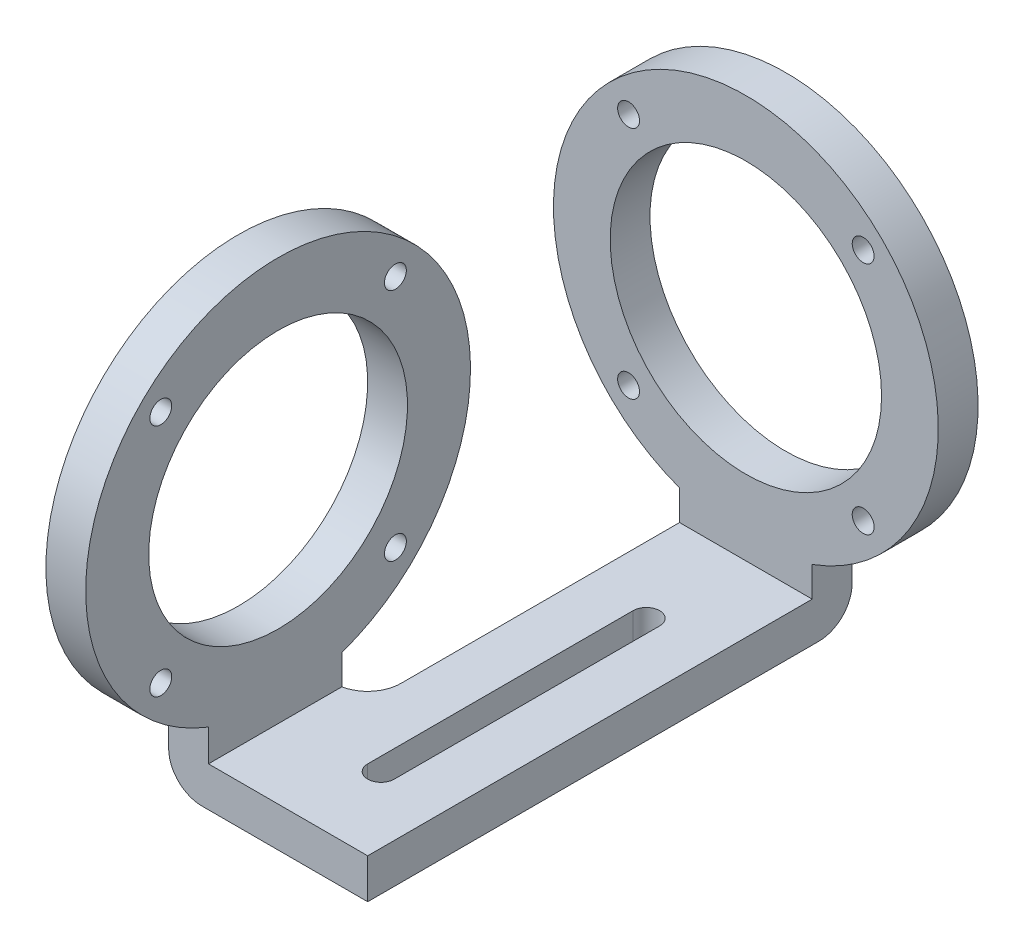
ISO-10303-21;
HEADER;
FILE_DESCRIPTION(('STEP AP214'),'2;1');
FILE_NAME('part.step','',(''),(''),'','','');
FILE_SCHEMA(('AUTOMOTIVE_DESIGN { 1 0 10303 214 1 1 1 1 }'));
ENDSEC;
DATA;
#1=APPLICATION_CONTEXT('core data for automotive mechanical design processes');
#2=APPLICATION_PROTOCOL_DEFINITION('international standard','automotive_design',2000,#1);
#3=PRODUCT_CONTEXT('',#1,'mechanical');
#4=PRODUCT('Part','Part','',(#3));
#5=PRODUCT_RELATED_PRODUCT_CATEGORY('part','',(#4));
#6=PRODUCT_DEFINITION_FORMATION('','',#4);
#7=PRODUCT_DEFINITION_CONTEXT('part definition',#1,'design');
#8=PRODUCT_DEFINITION('design','',#6,#7);
#9=PRODUCT_DEFINITION_SHAPE('','',#8);
#10=(LENGTH_UNIT() NAMED_UNIT(*) SI_UNIT(.MILLI.,.METRE.));
#11=(NAMED_UNIT(*) PLANE_ANGLE_UNIT() SI_UNIT($,.RADIAN.));
#12=(NAMED_UNIT(*) SI_UNIT($,.STERADIAN.) SOLID_ANGLE_UNIT());
#13=UNCERTAINTY_MEASURE_WITH_UNIT(LENGTH_MEASURE(1.E-05),#10,'distance_accuracy_value','');
#14=(GEOMETRIC_REPRESENTATION_CONTEXT(3) GLOBAL_UNCERTAINTY_ASSIGNED_CONTEXT((#13)) GLOBAL_UNIT_ASSIGNED_CONTEXT((#10,
#11,#12)) REPRESENTATION_CONTEXT('',''));
#15=CARTESIAN_POINT('',(0.,0.,0.));
#16=DIRECTION('',(0.,0.,1.));
#17=DIRECTION('',(1.,0.,0.));
#18=AXIS2_PLACEMENT_3D('',#15,#16,#17);
#19=CARTESIAN_POINT('',(-9.99999999999999,-31.748471388918,73.));
#20=DIRECTION('',(0.,-1.,0.));
#21=DIRECTION('',(0.,0.,-1.));
#22=AXIS2_PLACEMENT_3D('',#19,#20,#21);
#23=PLANE('',#22);
#24=DIRECTION('',(0.,0.,1.));
#25=VECTOR('',#24,1.);
#26=CARTESIAN_POINT('',(2.00000000000001,-31.748471388918,61.));
#27=LINE('',#26,#25);
#28=CARTESIAN_POINT('',(2.,-31.748471388918,21.));
#29=VERTEX_POINT('',#28);
#30=CARTESIAN_POINT('',(2.00000000000001,-31.748471388918,61.));
#31=VERTEX_POINT('',#30);
#32=EDGE_CURVE('E174',#29,#31,#27,.T.);
#33=ORIENTED_EDGE('',*,*,#32,.T.);
#34=CARTESIAN_POINT('',(0.,-31.748471388918,61.));
#35=DIRECTION('',(0.,-1.,0.));
#36=DIRECTION('',(0.,0.,-1.));
#37=AXIS2_PLACEMENT_3D('',#34,#35,#36);
#38=CIRCLE('',#37,2.00000000000001);
#39=CARTESIAN_POINT('',(-2.00000000000001,-31.748471388918,61.));
#40=VERTEX_POINT('',#39);
#41=EDGE_CURVE('E165',#31,#40,#38,.T.);
#42=ORIENTED_EDGE('',*,*,#41,.T.);
#43=DIRECTION('',(0.,0.,-1.));
#44=VECTOR('',#43,1.);
#45=CARTESIAN_POINT('',(-2.00000000000001,-31.748471388918,61.));
#46=LINE('',#45,#44);
#47=CARTESIAN_POINT('',(-2.00000000000001,-31.748471388918,21.));
#48=VERTEX_POINT('',#47);
#49=EDGE_CURVE('E178',#40,#48,#46,.T.);
#50=ORIENTED_EDGE('',*,*,#49,.T.);
#51=CARTESIAN_POINT('',(0.,-31.748471388918,21.));
#52=DIRECTION('',(0.,-1.,0.));
#53=DIRECTION('',(0.,0.,-1.));
#54=AXIS2_PLACEMENT_3D('',#51,#52,#53);
#55=CIRCLE('',#54,2.00000000000001);
#56=EDGE_CURVE('E183',#48,#29,#55,.T.);
#57=ORIENTED_EDGE('',*,*,#56,.T.);
#58=EDGE_LOOP('',(#33,#42,#50,#57));
#59=FACE_BOUND('',#58,.T.);
#60=DIRECTION('',(0.,0.,-1.));
#61=VECTOR('',#60,1.);
#62=CARTESIAN_POINT('',(-14.0000000000003,-31.748471388918,53.));
#63=LINE('',#62,#61);
#64=CARTESIAN_POINT('',(-14.0000000000003,-31.748471388918,73.));
#65=VERTEX_POINT('',#64);
#66=CARTESIAN_POINT('',(-14.0000000000003,-31.748471388918,52.8989794855664));
#67=VERTEX_POINT('',#66);
#68=EDGE_CURVE('E61',#65,#67,#63,.T.);
#69=ORIENTED_EDGE('',*,*,#68,.F.);
#70=DIRECTION('',(-1.,0.,0.));
#71=VECTOR('',#70,1.);
#72=CARTESIAN_POINT('',(-9.99999999999999,-31.748471388918,73.));
#73=LINE('',#72,#71);
#74=CARTESIAN_POINT('',(10.,-31.748471388918,73.));
#75=VERTEX_POINT('',#74);
#76=EDGE_CURVE('E289',#75,#65,#73,.T.);
#77=ORIENTED_EDGE('',*,*,#76,.F.);
#78=DIRECTION('',(0.,0.,-1.));
#79=VECTOR('',#78,1.);
#80=CARTESIAN_POINT('',(10.,-31.748471388918,73.));
#81=LINE('',#80,#79);
#82=CARTESIAN_POINT('',(10.,-31.748471388918,6.));
#83=VERTEX_POINT('',#82);
#84=EDGE_CURVE('E299',#75,#83,#81,.T.);
#85=ORIENTED_EDGE('',*,*,#84,.T.);
#86=DIRECTION('',(-1.,0.,0.));
#87=VECTOR('',#86,1.);
#88=CARTESIAN_POINT('',(-9.99999999999999,-31.748471388918,6.));
#89=LINE('',#88,#87);
#90=CARTESIAN_POINT('',(-9.99999999999999,-31.748471388918,6.));
#91=VERTEX_POINT('',#90);
#92=EDGE_CURVE('E282',#83,#91,#89,.T.);
#93=ORIENTED_EDGE('',*,*,#92,.T.);
#94=DIRECTION('',(0.,0.,-1.));
#95=VECTOR('',#94,1.);
#96=CARTESIAN_POINT('',(-9.99999999999999,-31.748471388918,73.));
#97=LINE('',#96,#95);
#98=CARTESIAN_POINT('',(-9.99999999999999,-31.748471388918,48.));
#99=VERTEX_POINT('',#98);
#100=EDGE_CURVE('E293',#99,#91,#97,.T.);
#101=ORIENTED_EDGE('',*,*,#100,.F.);
#102=CARTESIAN_POINT('',(-15.,-31.748471388918,48.));
#103=DIRECTION('',(0.,-1.,0.));
#104=DIRECTION('',(0.,0.,-1.));
#105=AXIS2_PLACEMENT_3D('',#102,#103,#104);
#106=CIRCLE('',#105,5.);
#107=EDGE_CURVE('E55',#99,#67,#106,.T.);
#108=ORIENTED_EDGE('',*,*,#107,.T.);
#109=EDGE_LOOP('',(#69,#77,#85,#93,#101,#108));
#110=FACE_BOUND('',#109,.T.);
#111=ADVANCED_FACE('F45',(#59,#110),#23,.F.);
#112=CARTESIAN_POINT('',(-10.,-25.748471388918,0.));
#113=DIRECTION('',(-1.,0.,0.));
#114=DIRECTION('',(0.,-1.,0.));
#115=AXIS2_PLACEMENT_3D('',#112,#113,#114);
#116=PLANE('',#115);
#117=DIRECTION('',(0.,0.,1.));
#118=VECTOR('',#117,1.);
#119=CARTESIAN_POINT('',(-9.99999999999999,-37.748471388918,0.));
#120=LINE('',#119,#118);
#121=CARTESIAN_POINT('',(-9.99999999999999,-37.748471388918,5.));
#122=VERTEX_POINT('',#121);
#123=CARTESIAN_POINT('',(-9.99999999999999,-37.748471388918,48.));
#124=VERTEX_POINT('',#123);
#125=EDGE_CURVE('E312',#122,#124,#120,.T.);
#126=ORIENTED_EDGE('',*,*,#125,.T.);
#127=DIRECTION('',(0.,-1.,0.));
#128=VECTOR('',#127,1.);
#129=CARTESIAN_POINT('',(-10.,-25.748471388918,48.));
#130=LINE('',#129,#128);
#131=EDGE_CURVE('E412',#124,#99,#130,.F.);
#132=ORIENTED_EDGE('',*,*,#131,.T.);
#133=ORIENTED_EDGE('',*,*,#100,.T.);
#134=DIRECTION('',(0.,-1.,0.));
#135=VECTOR('',#134,1.);
#136=CARTESIAN_POINT('',(-10.,-25.748471388918,6.));
#137=LINE('',#136,#135);
#138=CARTESIAN_POINT('',(-10.,-27.2213151776324,6.));
#139=VERTEX_POINT('',#138);
#140=EDGE_CURVE('E303',#139,#91,#137,.T.);
#141=ORIENTED_EDGE('',*,*,#140,.F.);
#142=DIRECTION('',(0.,0.,-1.));
#143=VECTOR('',#142,1.);
#144=CARTESIAN_POINT('',(-10.,-27.2213151776324,6.));
#145=LINE('',#144,#143);
#146=CARTESIAN_POINT('',(-10.,-27.2213151776324,0.));
#147=VERTEX_POINT('',#146);
#148=EDGE_CURVE('E370',#147,#139,#145,.F.);
#149=ORIENTED_EDGE('',*,*,#148,.F.);
#150=DIRECTION('',(0.,-1.,0.));
#151=VECTOR('',#150,1.);
#152=CARTESIAN_POINT('',(-10.,-25.748471388918,0.));
#153=LINE('',#152,#151);
#154=CARTESIAN_POINT('',(-9.99999999999999,-32.748471388918,0.));
#155=VERTEX_POINT('',#154);
#156=EDGE_CURVE('E304',#147,#155,#153,.T.);
#157=ORIENTED_EDGE('',*,*,#156,.T.);
#158=CARTESIAN_POINT('',(-9.99999999999999,-32.748471388918,5.));
#159=DIRECTION('',(-1.,0.,0.));
#160=DIRECTION('',(0.,-1.,0.));
#161=AXIS2_PLACEMENT_3D('',#158,#159,#160);
#162=CIRCLE('',#161,5.);
#163=EDGE_CURVE('E395',#155,#122,#162,.T.);
#164=ORIENTED_EDGE('',*,*,#163,.T.);
#165=EDGE_LOOP('',(#126,#132,#133,#141,#149,#157,#164));
#166=FACE_BOUND('',#165,.T.);
#167=ADVANCED_FACE('F450',(#166),#116,.T.);
#168=CARTESIAN_POINT('',(0.,0.,6.));
#169=DIRECTION('',(0.,0.,1.));
#170=DIRECTION('',(1.,0.,0.));
#171=AXIS2_PLACEMENT_3D('',#168,#169,#170);
#172=PLANE('',#171);
#173=ORIENTED_EDGE('',*,*,#92,.F.);
#174=DIRECTION('',(0.,1.,0.));
#175=VECTOR('',#174,1.);
#176=CARTESIAN_POINT('',(10.,-37.748471388918,6.));
#177=LINE('',#176,#175);
#178=CARTESIAN_POINT('',(10.,-27.2213151776324,6.));
#179=VERTEX_POINT('',#178);
#180=EDGE_CURVE('E309',#83,#179,#177,.T.);
#181=ORIENTED_EDGE('',*,*,#180,.T.);
#182=CARTESIAN_POINT('',(0.,0.,6.));
#183=DIRECTION('',(0.,0.,1.));
#184=DIRECTION('',(1.,0.,0.));
#185=AXIS2_PLACEMENT_3D('',#182,#183,#184);
#186=CIRCLE('',#185,29.);
#187=EDGE_CURVE('E366',#179,#139,#186,.T.);
#188=ORIENTED_EDGE('',*,*,#187,.T.);
#189=ORIENTED_EDGE('',*,*,#140,.T.);
#190=EDGE_LOOP('',(#173,#181,#188,#189));
#191=FACE_BOUND('',#190,.T.);
#192=CARTESIAN_POINT('',(-17.6799999999999,17.6800000000001,6.));
#193=DIRECTION('',(0.,0.,1.));
#194=DIRECTION('',(1.,0.,0.));
#195=AXIS2_PLACEMENT_3D('',#192,#193,#194);
#196=CIRCLE('',#195,1.65);
#197=CARTESIAN_POINT('',(-16.0299999999999,17.6800000000001,6.));
#198=VERTEX_POINT('',#197);
#199=EDGE_CURVE('E334',#198,#198,#196,.T.);
#200=ORIENTED_EDGE('',*,*,#199,.F.);
#201=EDGE_LOOP('',(#200));
#202=FACE_BOUND('',#201,.T.);
#203=CARTESIAN_POINT('',(0.,0.,6.));
#204=DIRECTION('',(0.,0.,1.));
#205=DIRECTION('',(1.,0.,0.));
#206=AXIS2_PLACEMENT_3D('',#203,#204,#205);
#207=CIRCLE('',#206,20.45);
#208=CARTESIAN_POINT('',(20.45,0.,6.));
#209=VERTEX_POINT('',#208);
#210=EDGE_CURVE('E350',#209,#209,#207,.T.);
#211=ORIENTED_EDGE('',*,*,#210,.F.);
#212=EDGE_LOOP('',(#211));
#213=FACE_BOUND('',#212,.T.);
#214=CARTESIAN_POINT('',(17.68,-17.68,6.));
#215=DIRECTION('',(0.,0.,1.));
#216=DIRECTION('',(1.,0.,0.));
#217=AXIS2_PLACEMENT_3D('',#214,#215,#216);
#218=CIRCLE('',#217,1.65);
#219=CARTESIAN_POINT('',(19.33,-17.68,6.));
#220=VERTEX_POINT('',#219);
#221=EDGE_CURVE('E358',#220,#220,#218,.T.);
#222=ORIENTED_EDGE('',*,*,#221,.F.);
#223=EDGE_LOOP('',(#222));
#224=FACE_BOUND('',#223,.T.);
#225=CARTESIAN_POINT('',(-17.6800000000001,-17.6799999999999,6.));
#226=DIRECTION('',(0.,0.,1.));
#227=DIRECTION('',(1.,0.,0.));
#228=AXIS2_PLACEMENT_3D('',#225,#226,#227);
#229=CIRCLE('',#228,1.65);
#230=CARTESIAN_POINT('',(-16.0300000000001,-17.6799999999999,6.));
#231=VERTEX_POINT('',#230);
#232=EDGE_CURVE('E342',#231,#231,#229,.T.);
#233=ORIENTED_EDGE('',*,*,#232,.F.);
#234=EDGE_LOOP('',(#233));
#235=FACE_BOUND('',#234,.T.);
#236=CARTESIAN_POINT('',(17.6800000000002,17.6799999999998,6.));
#237=DIRECTION('',(0.,0.,1.));
#238=DIRECTION('',(1.,0.,0.));
#239=AXIS2_PLACEMENT_3D('',#236,#237,#238);
#240=CIRCLE('',#239,1.65);
#241=CARTESIAN_POINT('',(19.3300000000002,17.6799999999998,6.));
#242=VERTEX_POINT('',#241);
#243=EDGE_CURVE('E326',#242,#242,#240,.T.);
#244=ORIENTED_EDGE('',*,*,#243,.F.);
#245=EDGE_LOOP('',(#244));
#246=FACE_BOUND('',#245,.T.);
#247=ADVANCED_FACE('F461',(#191,#202,#213,#224,#235,#246),#172,.T.);
#248=CARTESIAN_POINT('',(0.,0.,0.));
#249=DIRECTION('',(0.,0.,1.));
#250=DIRECTION('',(1.,0.,0.));
#251=AXIS2_PLACEMENT_3D('',#248,#249,#250);
#252=PLANE('',#251);
#253=DIRECTION('',(0.,1.,0.));
#254=VECTOR('',#253,1.);
#255=CARTESIAN_POINT('',(10.,-37.748471388918,0.));
#256=LINE('',#255,#254);
#257=CARTESIAN_POINT('',(10.,-32.748471388918,0.));
#258=VERTEX_POINT('',#257);
#259=CARTESIAN_POINT('',(10.,-27.2213151776324,0.));
#260=VERTEX_POINT('',#259);
#261=EDGE_CURVE('E308',#258,#260,#256,.T.);
#262=ORIENTED_EDGE('',*,*,#261,.F.);
#263=DIRECTION('',(1.,0.,0.));
#264=VECTOR('',#263,1.);
#265=CARTESIAN_POINT('',(-9.99999999999999,-32.748471388918,0.));
#266=LINE('',#265,#264);
#267=EDGE_CURVE('E392',#258,#155,#266,.F.);
#268=ORIENTED_EDGE('',*,*,#267,.T.);
#269=ORIENTED_EDGE('',*,*,#156,.F.);
#270=CARTESIAN_POINT('',(0.,0.,0.));
#271=DIRECTION('',(0.,0.,1.));
#272=DIRECTION('',(1.,0.,0.));
#273=AXIS2_PLACEMENT_3D('',#270,#271,#272);
#274=CIRCLE('',#273,29.);
#275=EDGE_CURVE('E362',#260,#147,#274,.T.);
#276=ORIENTED_EDGE('',*,*,#275,.F.);
#277=EDGE_LOOP('',(#262,#268,#269,#276));
#278=FACE_BOUND('',#277,.T.);
#279=CARTESIAN_POINT('',(17.68,-17.68,0.));
#280=DIRECTION('',(0.,0.,1.));
#281=DIRECTION('',(1.,0.,0.));
#282=AXIS2_PLACEMENT_3D('',#279,#280,#281);
#283=CIRCLE('',#282,1.65);
#284=CARTESIAN_POINT('',(19.33,-17.68,0.));
#285=VERTEX_POINT('',#284);
#286=EDGE_CURVE('E354',#285,#285,#283,.T.);
#287=ORIENTED_EDGE('',*,*,#286,.T.);
#288=EDGE_LOOP('',(#287));
#289=FACE_BOUND('',#288,.T.);
#290=CARTESIAN_POINT('',(0.,0.,0.));
#291=DIRECTION('',(0.,0.,1.));
#292=DIRECTION('',(1.,0.,0.));
#293=AXIS2_PLACEMENT_3D('',#290,#291,#292);
#294=CIRCLE('',#293,20.45);
#295=CARTESIAN_POINT('',(20.45,0.,0.));
#296=VERTEX_POINT('',#295);
#297=EDGE_CURVE('E346',#296,#296,#294,.T.);
#298=ORIENTED_EDGE('',*,*,#297,.T.);
#299=EDGE_LOOP('',(#298));
#300=FACE_BOUND('',#299,.T.);
#301=CARTESIAN_POINT('',(-17.6800000000001,-17.6799999999999,0.));
#302=DIRECTION('',(0.,0.,1.));
#303=DIRECTION('',(1.,0.,0.));
#304=AXIS2_PLACEMENT_3D('',#301,#302,#303);
#305=CIRCLE('',#304,1.65);
#306=CARTESIAN_POINT('',(-16.0300000000001,-17.6799999999999,0.));
#307=VERTEX_POINT('',#306);
#308=EDGE_CURVE('E338',#307,#307,#305,.T.);
#309=ORIENTED_EDGE('',*,*,#308,.T.);
#310=EDGE_LOOP('',(#309));
#311=FACE_BOUND('',#310,.T.);
#312=CARTESIAN_POINT('',(-17.6799999999999,17.6800000000001,0.));
#313=DIRECTION('',(0.,0.,1.));
#314=DIRECTION('',(1.,0.,0.));
#315=AXIS2_PLACEMENT_3D('',#312,#313,#314);
#316=CIRCLE('',#315,1.65);
#317=CARTESIAN_POINT('',(-16.0299999999999,17.6800000000001,0.));
#318=VERTEX_POINT('',#317);
#319=EDGE_CURVE('E330',#318,#318,#316,.T.);
#320=ORIENTED_EDGE('',*,*,#319,.T.);
#321=EDGE_LOOP('',(#320));
#322=FACE_BOUND('',#321,.T.);
#323=CARTESIAN_POINT('',(17.6800000000002,17.6799999999998,0.));
#324=DIRECTION('',(0.,0.,1.));
#325=DIRECTION('',(1.,0.,0.));
#326=AXIS2_PLACEMENT_3D('',#323,#324,#325);
#327=CIRCLE('',#326,1.65);
#328=CARTESIAN_POINT('',(19.3300000000002,17.6799999999998,0.));
#329=VERTEX_POINT('',#328);
#330=EDGE_CURVE('E322',#329,#329,#327,.T.);
#331=ORIENTED_EDGE('',*,*,#330,.T.);
#332=EDGE_LOOP('',(#331));
#333=FACE_BOUND('',#332,.T.);
#334=ADVANCED_FACE('F485',(#278,#289,#300,#311,#322,#333),#252,.F.);
#335=CARTESIAN_POINT('',(0.,0.,6.));
#336=DIRECTION('',(0.,0.,-1.));
#337=DIRECTION('',(-1.,0.,0.));
#338=AXIS2_PLACEMENT_3D('',#335,#336,#337);
#339=CYLINDRICAL_SURFACE('',#338,29.);
#340=ORIENTED_EDGE('',*,*,#187,.F.);
#341=DIRECTION('',(0.,0.,-1.));
#342=VECTOR('',#341,1.);
#343=CARTESIAN_POINT('',(10.,-27.2213151776324,6.));
#344=LINE('',#343,#342);
#345=EDGE_CURVE('E377',#179,#260,#344,.T.);
#346=ORIENTED_EDGE('',*,*,#345,.T.);
#347=ORIENTED_EDGE('',*,*,#275,.T.);
#348=ORIENTED_EDGE('',*,*,#148,.T.);
#349=EDGE_LOOP('',(#340,#346,#347,#348));
#350=FACE_BOUND('',#349,.T.);
#351=ADVANCED_FACE('F481',(#350),#339,.T.);
#352=CARTESIAN_POINT('',(17.68,-17.68,6.));
#353=DIRECTION('',(0.,0.,-1.));
#354=DIRECTION('',(-1.,0.,0.));
#355=AXIS2_PLACEMENT_3D('',#352,#353,#354);
#356=CYLINDRICAL_SURFACE('',#355,1.65);
#357=ORIENTED_EDGE('',*,*,#221,.T.);
#358=EDGE_LOOP('',(#357));
#359=FACE_BOUND('',#358,.T.);
#360=ORIENTED_EDGE('',*,*,#286,.F.);
#361=EDGE_LOOP('',(#360));
#362=FACE_BOUND('',#361,.T.);
#363=ADVANCED_FACE('F477',(#359,#362),#356,.F.);
#364=CARTESIAN_POINT('',(0.,0.,6.));
#365=DIRECTION('',(0.,0.,-1.));
#366=DIRECTION('',(-1.,0.,0.));
#367=AXIS2_PLACEMENT_3D('',#364,#365,#366);
#368=CYLINDRICAL_SURFACE('',#367,20.45);
#369=ORIENTED_EDGE('',*,*,#210,.T.);
#370=EDGE_LOOP('',(#369));
#371=FACE_BOUND('',#370,.T.);
#372=ORIENTED_EDGE('',*,*,#297,.F.);
#373=EDGE_LOOP('',(#372));
#374=FACE_BOUND('',#373,.T.);
#375=ADVANCED_FACE('F473',(#371,#374),#368,.F.);
#376=CARTESIAN_POINT('',(-17.6800000000001,-17.6799999999999,6.));
#377=DIRECTION('',(0.,0.,-1.));
#378=DIRECTION('',(-1.,0.,0.));
#379=AXIS2_PLACEMENT_3D('',#376,#377,#378);
#380=CYLINDRICAL_SURFACE('',#379,1.65);
#381=ORIENTED_EDGE('',*,*,#232,.T.);
#382=EDGE_LOOP('',(#381));
#383=FACE_BOUND('',#382,.T.);
#384=ORIENTED_EDGE('',*,*,#308,.F.);
#385=EDGE_LOOP('',(#384));
#386=FACE_BOUND('',#385,.T.);
#387=ADVANCED_FACE('F469',(#383,#386),#380,.F.);
#388=CARTESIAN_POINT('',(-17.6799999999999,17.6800000000001,6.));
#389=DIRECTION('',(0.,0.,-1.));
#390=DIRECTION('',(-1.,0.,0.));
#391=AXIS2_PLACEMENT_3D('',#388,#389,#390);
#392=CYLINDRICAL_SURFACE('',#391,1.65);
#393=ORIENTED_EDGE('',*,*,#199,.T.);
#394=EDGE_LOOP('',(#393));
#395=FACE_BOUND('',#394,.T.);
#396=ORIENTED_EDGE('',*,*,#319,.F.);
#397=EDGE_LOOP('',(#396));
#398=FACE_BOUND('',#397,.T.);
#399=ADVANCED_FACE('F465',(#395,#398),#392,.F.);
#400=CARTESIAN_POINT('',(17.6800000000002,17.6799999999998,6.));
#401=DIRECTION('',(0.,0.,-1.));
#402=DIRECTION('',(-1.,0.,0.));
#403=AXIS2_PLACEMENT_3D('',#400,#401,#402);
#404=CYLINDRICAL_SURFACE('',#403,1.65);
#405=ORIENTED_EDGE('',*,*,#243,.T.);
#406=EDGE_LOOP('',(#405));
#407=FACE_BOUND('',#406,.T.);
#408=ORIENTED_EDGE('',*,*,#330,.F.);
#409=EDGE_LOOP('',(#408));
#410=FACE_BOUND('',#409,.T.);
#411=ADVANCED_FACE('F454',(#407,#410),#404,.F.);
#412=CARTESIAN_POINT('',(10.,-37.748471388918,0.));
#413=DIRECTION('',(1.,0.,0.));
#414=DIRECTION('',(0.,0.,-1.));
#415=AXIS2_PLACEMENT_3D('',#412,#413,#414);
#416=PLANE('',#415);
#417=DIRECTION('',(0.,0.,1.));
#418=VECTOR('',#417,1.);
#419=CARTESIAN_POINT('',(10.,-37.748471388918,0.));
#420=LINE('',#419,#418);
#421=CARTESIAN_POINT('',(10.,-37.748471388918,5.));
#422=VERTEX_POINT('',#421);
#423=CARTESIAN_POINT('',(10.0000000000001,-37.748471388918,73.));
#424=VERTEX_POINT('',#423);
#425=EDGE_CURVE('E318',#422,#424,#420,.T.);
#426=ORIENTED_EDGE('',*,*,#425,.F.);
#427=CARTESIAN_POINT('',(10.,-32.748471388918,5.));
#428=DIRECTION('',(1.,0.,0.));
#429=DIRECTION('',(0.,0.,-1.));
#430=AXIS2_PLACEMENT_3D('',#427,#428,#429);
#431=CIRCLE('',#430,5.);
#432=EDGE_CURVE('E389',#422,#258,#431,.T.);
#433=ORIENTED_EDGE('',*,*,#432,.T.);
#434=ORIENTED_EDGE('',*,*,#261,.T.);
#435=ORIENTED_EDGE('',*,*,#345,.F.);
#436=ORIENTED_EDGE('',*,*,#180,.F.);
#437=ORIENTED_EDGE('',*,*,#84,.F.);
#438=DIRECTION('',(0.,1.,0.));
#439=VECTOR('',#438,1.);
#440=CARTESIAN_POINT('',(10.0000000000001,-37.748471388918,73.));
#441=LINE('',#440,#439);
#442=EDGE_CURVE('E286',#424,#75,#441,.T.);
#443=ORIENTED_EDGE('',*,*,#442,.F.);
#444=EDGE_LOOP('',(#426,#433,#434,#435,#436,#437,#443));
#445=FACE_BOUND('',#444,.T.);
#446=ADVANCED_FACE('F451',(#445),#416,.T.);
#447=CARTESIAN_POINT('',(-9.99999999999999,-37.748471388918,0.));
#448=DIRECTION('',(0.,-1.,0.));
#449=DIRECTION('',(0.,0.,-1.));
#450=AXIS2_PLACEMENT_3D('',#447,#448,#449);
#451=PLANE('',#450);
#452=CARTESIAN_POINT('',(0.,-37.748471388918,61.));
#453=DIRECTION('',(0.,-1.,0.));
#454=DIRECTION('',(0.,0.,-1.));
#455=AXIS2_PLACEMENT_3D('',#452,#453,#454);
#456=CIRCLE('',#455,2.00000000000001);
#457=CARTESIAN_POINT('',(2.00000000000001,-37.748471388918,61.));
#458=VERTEX_POINT('',#457);
#459=CARTESIAN_POINT('',(-2.00000000000001,-37.748471388918,61.));
#460=VERTEX_POINT('',#459);
#461=EDGE_CURVE('E168',#458,#460,#456,.T.);
#462=ORIENTED_EDGE('',*,*,#461,.F.);
#463=DIRECTION('',(0.,0.,1.));
#464=VECTOR('',#463,1.);
#465=CARTESIAN_POINT('',(2.00000000000001,-37.748471388918,61.));
#466=LINE('',#465,#464);
#467=CARTESIAN_POINT('',(2.,-37.748471388918,21.));
#468=VERTEX_POINT('',#467);
#469=EDGE_CURVE('E188',#468,#458,#466,.T.);
#470=ORIENTED_EDGE('',*,*,#469,.F.);
#471=CARTESIAN_POINT('',(0.,-37.748471388918,21.));
#472=DIRECTION('',(0.,-1.,0.));
#473=DIRECTION('',(0.,0.,-1.));
#474=AXIS2_PLACEMENT_3D('',#471,#472,#473);
#475=CIRCLE('',#474,2.00000000000001);
#476=CARTESIAN_POINT('',(-2.00000000000001,-37.748471388918,21.));
#477=VERTEX_POINT('',#476);
#478=EDGE_CURVE('E192',#477,#468,#475,.T.);
#479=ORIENTED_EDGE('',*,*,#478,.F.);
#480=DIRECTION('',(0.,0.,-1.));
#481=VECTOR('',#480,1.);
#482=CARTESIAN_POINT('',(-2.00000000000001,-37.748471388918,61.));
#483=LINE('',#482,#481);
#484=EDGE_CURVE('E201',#460,#477,#483,.T.);
#485=ORIENTED_EDGE('',*,*,#484,.F.);
#486=EDGE_LOOP('',(#462,#470,#479,#485));
#487=FACE_BOUND('',#486,.T.);
#488=ORIENTED_EDGE('',*,*,#125,.F.);
#489=DIRECTION('',(1.,0.,0.));
#490=VECTOR('',#489,1.);
#491=CARTESIAN_POINT('',(10.,-37.748471388918,5.));
#492=LINE('',#491,#490);
#493=EDGE_CURVE('E385',#122,#422,#492,.T.);
#494=ORIENTED_EDGE('',*,*,#493,.T.);
#495=ORIENTED_EDGE('',*,*,#425,.T.);
#496=DIRECTION('',(1.,0.,0.));
#497=VECTOR('',#496,1.);
#498=CARTESIAN_POINT('',(-9.99999999999999,-37.748471388918,73.));
#499=LINE('',#498,#497);
#500=CARTESIAN_POINT('',(-15.0000000000003,-37.748471388918,73.));
#501=VERTEX_POINT('',#500);
#502=EDGE_CURVE('E283',#501,#424,#499,.T.);
#503=ORIENTED_EDGE('',*,*,#502,.F.);
#504=DIRECTION('',(0.,0.,1.));
#505=VECTOR('',#504,1.);
#506=CARTESIAN_POINT('',(-15.0000000000003,-37.748471388918,53.));
#507=LINE('',#506,#505);
#508=CARTESIAN_POINT('',(-15.0000000000003,-37.7484713889179,53.));
#509=VERTEX_POINT('',#508);
#510=EDGE_CURVE('E381',#501,#509,#507,.F.);
#511=ORIENTED_EDGE('',*,*,#510,.T.);
#512=CARTESIAN_POINT('',(-15.,-37.748471388918,48.));
#513=DIRECTION('',(0.,-1.,0.));
#514=DIRECTION('',(0.,0.,-1.));
#515=AXIS2_PLACEMENT_3D('',#512,#513,#514);
#516=CIRCLE('',#515,5.);
#517=EDGE_CURVE('E423',#509,#124,#516,.F.);
#518=ORIENTED_EDGE('',*,*,#517,.T.);
#519=EDGE_LOOP('',(#488,#494,#495,#503,#511,#518));
#520=FACE_BOUND('',#519,.T.);
#521=ADVANCED_FACE('F446',(#487,#520),#451,.T.);
#522=CARTESIAN_POINT('',(0.,0.,73.));
#523=DIRECTION('',(0.,0.,-1.));
#524=DIRECTION('',(-1.,0.,0.));
#525=AXIS2_PLACEMENT_3D('',#522,#523,#524);
#526=PLANE('',#525);
#527=DIRECTION('',(0.,1.,0.));
#528=VECTOR('',#527,1.);
#529=CARTESIAN_POINT('',(-20.0000000000003,-31.7484713889179,73.));
#530=LINE('',#529,#528);
#531=CARTESIAN_POINT('',(-20.0000000000003,-32.7484713889179,73.));
#532=VERTEX_POINT('',#531);
#533=CARTESIAN_POINT('',(-20.0000000000003,-26.9465308293367,73.));
#534=VERTEX_POINT('',#533);
#535=EDGE_CURVE('E275',#532,#534,#530,.T.);
#536=ORIENTED_EDGE('',*,*,#535,.F.);
#537=CARTESIAN_POINT('',(-15.0000000000003,-32.748471388918,73.));
#538=DIRECTION('',(0.,0.,-1.));
#539=DIRECTION('',(-1.,0.,0.));
#540=AXIS2_PLACEMENT_3D('',#537,#538,#539);
#541=CIRCLE('',#540,5.);
#542=EDGE_CURVE('E402',#532,#501,#541,.F.);
#543=ORIENTED_EDGE('',*,*,#542,.T.);
#544=ORIENTED_EDGE('',*,*,#502,.T.);
#545=ORIENTED_EDGE('',*,*,#442,.T.);
#546=ORIENTED_EDGE('',*,*,#76,.T.);
#547=DIRECTION('',(0.,-1.,0.));
#548=VECTOR('',#547,1.);
#549=CARTESIAN_POINT('',(-14.0000000000003,-25.748471388918,73.));
#550=LINE('',#549,#548);
#551=CARTESIAN_POINT('',(-14.0000000000003,-26.9465308293368,73.));
#552=VERTEX_POINT('',#551);
#553=EDGE_CURVE('E272',#552,#65,#550,.T.);
#554=ORIENTED_EDGE('',*,*,#553,.F.);
#555=DIRECTION('',(-1.,0.,0.));
#556=VECTOR('',#555,1.);
#557=CARTESIAN_POINT('',(-14.0000000000003,-26.9465308293368,73.));
#558=LINE('',#557,#556);
#559=EDGE_CURVE('E266',#552,#534,#558,.T.);
#560=ORIENTED_EDGE('',*,*,#559,.T.);
#561=EDGE_LOOP('',(#536,#543,#544,#545,#546,#554,#560));
#562=FACE_BOUND('',#561,.T.);
#563=ADVANCED_FACE('F442',(#562),#526,.F.);
#564=CARTESIAN_POINT('',(-20.0000000000003,-31.7484713889179,53.));
#565=DIRECTION('',(0.,0.,1.));
#566=DIRECTION('',(1.,0.,0.));
#567=AXIS2_PLACEMENT_3D('',#564,#565,#566);
#568=PLANE('',#567);
#569=DIRECTION('',(-1.,0.,0.));
#570=VECTOR('',#569,1.);
#571=CARTESIAN_POINT('',(-14.0000000000003,-27.311133402091,53.));
#572=LINE('',#571,#570);
#573=CARTESIAN_POINT('',(-20.0000000000003,-27.3111334020909,53.));
#574=VERTEX_POINT('',#573);
#575=CARTESIAN_POINT('',(-15.,-27.311133402091,53.));
#576=VERTEX_POINT('',#575);
#577=EDGE_CURVE('E259',#574,#576,#572,.F.);
#578=ORIENTED_EDGE('',*,*,#577,.T.);
#579=DIRECTION('',(0.,-1.,0.));
#580=VECTOR('',#579,1.);
#581=CARTESIAN_POINT('',(-15.,-31.7484713889179,53.));
#582=LINE('',#581,#580);
#583=EDGE_CURVE('E408',#576,#509,#582,.T.);
#584=ORIENTED_EDGE('',*,*,#583,.T.);
#585=CARTESIAN_POINT('',(-15.0000000000003,-32.748471388918,53.));
#586=DIRECTION('',(0.,0.,1.));
#587=DIRECTION('',(1.,0.,0.));
#588=AXIS2_PLACEMENT_3D('',#585,#586,#587);
#589=CIRCLE('',#588,5.);
#590=CARTESIAN_POINT('',(-20.0000000000003,-32.7484713889179,53.));
#591=VERTEX_POINT('',#590);
#592=EDGE_CURVE('E405',#509,#591,#589,.F.);
#593=ORIENTED_EDGE('',*,*,#592,.T.);
#594=DIRECTION('',(0.,-1.,0.));
#595=VECTOR('',#594,1.);
#596=CARTESIAN_POINT('',(-20.0000000000003,-31.7484713889179,53.));
#597=LINE('',#596,#595);
#598=EDGE_CURVE('E278',#574,#591,#597,.T.);
#599=ORIENTED_EDGE('',*,*,#598,.F.);
#600=EDGE_LOOP('',(#578,#584,#593,#599));
#601=FACE_BOUND('',#600,.T.);
#602=ADVANCED_FACE('F438',(#601),#568,.F.);
#603=CARTESIAN_POINT('',(-20.,2.09901540593194E-13,0.));
#604=DIRECTION('',(1.,0.,0.));
#605=DIRECTION('',(0.,1.,0.));
#606=AXIS2_PLACEMENT_3D('',#603,#604,#605);
#607=PLANE('',#606);
#608=ORIENTED_EDGE('',*,*,#598,.T.);
#609=DIRECTION('',(0.,0.,1.));
#610=VECTOR('',#609,1.);
#611=CARTESIAN_POINT('',(-20.0000000000003,-32.7484713889179,73.));
#612=LINE('',#611,#610);
#613=EDGE_CURVE('E398',#591,#532,#612,.T.);
#614=ORIENTED_EDGE('',*,*,#613,.T.);
#615=ORIENTED_EDGE('',*,*,#535,.T.);
#616=CARTESIAN_POINT('',(-20.,0.0873505141632854,62.50384548963));
#617=DIRECTION('',(-1.,0.,0.));
#618=DIRECTION('',(0.,-1.,0.));
#619=AXIS2_PLACEMENT_3D('',#616,#617,#618);
#620=CIRCLE('',#619,29.);
#621=EDGE_CURVE('E252',#534,#574,#620,.T.);
#622=ORIENTED_EDGE('',*,*,#621,.T.);
#623=EDGE_LOOP('',(#608,#614,#615,#622));
#624=FACE_BOUND('',#623,.T.);
#625=CARTESIAN_POINT('',(-20.0000000000002,-17.5926494858367,80.18384548963));
#626=DIRECTION('',(-1.,0.,0.));
#627=DIRECTION('',(0.,-1.,0.));
#628=AXIS2_PLACEMENT_3D('',#625,#626,#627);
#629=CIRCLE('',#628,1.65);
#630=CARTESIAN_POINT('',(-20.0000000000002,-19.2426494858367,80.18384548963));
#631=VERTEX_POINT('',#630);
#632=EDGE_CURVE('E244',#631,#631,#629,.T.);
#633=ORIENTED_EDGE('',*,*,#632,.F.);
#634=EDGE_LOOP('',(#633));
#635=FACE_BOUND('',#634,.T.);
#636=CARTESIAN_POINT('',(-20.,0.0873505141632854,62.50384548963));
#637=DIRECTION('',(-1.,0.,0.));
#638=DIRECTION('',(0.,-1.,0.));
#639=AXIS2_PLACEMENT_3D('',#636,#637,#638);
#640=CIRCLE('',#639,19.5);
#641=CARTESIAN_POINT('',(-20.0000000000002,-19.4126494858367,62.50384548963));
#642=VERTEX_POINT('',#641);
#643=EDGE_CURVE('E236',#642,#642,#640,.T.);
#644=ORIENTED_EDGE('',*,*,#643,.F.);
#645=EDGE_LOOP('',(#644));
#646=FACE_BOUND('',#645,.T.);
#647=CARTESIAN_POINT('',(-20.0000000000002,-17.5926494858367,44.8238454896299));
#648=DIRECTION('',(-1.,0.,0.));
#649=DIRECTION('',(0.,-1.,0.));
#650=AXIS2_PLACEMENT_3D('',#647,#648,#649);
#651=CIRCLE('',#650,1.65);
#652=CARTESIAN_POINT('',(-20.0000000000002,-19.2426494858367,44.8238454896299));
#653=VERTEX_POINT('',#652);
#654=EDGE_CURVE('E228',#653,#653,#651,.T.);
#655=ORIENTED_EDGE('',*,*,#654,.F.);
#656=EDGE_LOOP('',(#655));
#657=FACE_BOUND('',#656,.T.);
#658=CARTESIAN_POINT('',(-19.9999999999998,17.7673505141634,44.8238454896301));
#659=DIRECTION('',(-1.,0.,0.));
#660=DIRECTION('',(0.,-1.,0.));
#661=AXIS2_PLACEMENT_3D('',#658,#659,#660);
#662=CIRCLE('',#661,1.65);
#663=CARTESIAN_POINT('',(-19.9999999999998,16.1173505141634,44.8238454896301));
#664=VERTEX_POINT('',#663);
#665=EDGE_CURVE('E220',#664,#664,#662,.T.);
#666=ORIENTED_EDGE('',*,*,#665,.F.);
#667=EDGE_LOOP('',(#666));
#668=FACE_BOUND('',#667,.T.);
#669=CARTESIAN_POINT('',(-19.9999999999998,17.7673505141631,80.1838454896302));
#670=DIRECTION('',(-1.,0.,0.));
#671=DIRECTION('',(0.,-1.,0.));
#672=AXIS2_PLACEMENT_3D('',#669,#670,#671);
#673=CIRCLE('',#672,1.65);
#674=CARTESIAN_POINT('',(-19.9999999999998,16.1173505141631,80.1838454896302));
#675=VERTEX_POINT('',#674);
#676=EDGE_CURVE('E210',#675,#675,#673,.T.);
#677=ORIENTED_EDGE('',*,*,#676,.F.);
#678=EDGE_LOOP('',(#677));
#679=FACE_BOUND('',#678,.T.);
#680=ADVANCED_FACE('F435',(#624,#635,#646,#657,#668,#679),#607,.F.);
#681=CARTESIAN_POINT('',(-14.0000000000003,-25.748471388918,53.));
#682=DIRECTION('',(-1.,0.,0.));
#683=DIRECTION('',(0.,0.,1.));
#684=AXIS2_PLACEMENT_3D('',#681,#682,#683);
#685=PLANE('',#684);
#686=CARTESIAN_POINT('',(-14.,0.087350514163223,62.50384548963));
#687=DIRECTION('',(-1.,0.,0.));
#688=DIRECTION('',(0.,-1.,0.));
#689=AXIS2_PLACEMENT_3D('',#686,#687,#688);
#690=CIRCLE('',#689,29.);
#691=CARTESIAN_POINT('',(-14.0000000000003,-27.2758830126695,52.8989794855664));
#692=VERTEX_POINT('',#691);
#693=EDGE_CURVE('E256',#552,#692,#690,.T.);
#694=ORIENTED_EDGE('',*,*,#693,.F.);
#695=ORIENTED_EDGE('',*,*,#553,.T.);
#696=ORIENTED_EDGE('',*,*,#68,.T.);
#697=DIRECTION('',(0.,-1.,0.));
#698=VECTOR('',#697,1.);
#699=CARTESIAN_POINT('',(-14.0000000000003,-31.748471388918,52.8989794855664));
#700=LINE('',#699,#698);
#701=EDGE_CURVE('E11',#67,#692,#700,.F.);
#702=ORIENTED_EDGE('',*,*,#701,.T.);
#703=EDGE_LOOP('',(#694,#695,#696,#702));
#704=FACE_BOUND('',#703,.T.);
#705=CARTESIAN_POINT('',(-13.9999999999998,17.7673505141631,80.1838454896302));
#706=DIRECTION('',(-1.,0.,0.));
#707=DIRECTION('',(0.,-1.,0.));
#708=AXIS2_PLACEMENT_3D('',#705,#706,#707);
#709=CIRCLE('',#708,1.65);
#710=CARTESIAN_POINT('',(-13.9999999999998,16.1173505141631,80.1838454896302));
#711=VERTEX_POINT('',#710);
#712=EDGE_CURVE('E216',#711,#711,#709,.T.);
#713=ORIENTED_EDGE('',*,*,#712,.T.);
#714=EDGE_LOOP('',(#713));
#715=FACE_BOUND('',#714,.T.);
#716=CARTESIAN_POINT('',(-13.9999999999998,17.7673505141634,44.8238454896301));
#717=DIRECTION('',(-1.,0.,0.));
#718=DIRECTION('',(0.,-1.,0.));
#719=AXIS2_PLACEMENT_3D('',#716,#717,#718);
#720=CIRCLE('',#719,1.65);
#721=CARTESIAN_POINT('',(-13.9999999999998,16.1173505141634,44.8238454896301));
#722=VERTEX_POINT('',#721);
#723=EDGE_CURVE('E224',#722,#722,#720,.T.);
#724=ORIENTED_EDGE('',*,*,#723,.T.);
#725=EDGE_LOOP('',(#724));
#726=FACE_BOUND('',#725,.T.);
#727=CARTESIAN_POINT('',(-14.0000000000002,-17.5926494858367,44.8238454896299));
#728=DIRECTION('',(-1.,0.,0.));
#729=DIRECTION('',(0.,-1.,0.));
#730=AXIS2_PLACEMENT_3D('',#727,#728,#729);
#731=CIRCLE('',#730,1.65);
#732=CARTESIAN_POINT('',(-14.0000000000002,-19.2426494858367,44.8238454896299));
#733=VERTEX_POINT('',#732);
#734=EDGE_CURVE('E232',#733,#733,#731,.T.);
#735=ORIENTED_EDGE('',*,*,#734,.T.);
#736=EDGE_LOOP('',(#735));
#737=FACE_BOUND('',#736,.T.);
#738=CARTESIAN_POINT('',(-14.,0.087350514163223,62.50384548963));
#739=DIRECTION('',(-1.,0.,0.));
#740=DIRECTION('',(0.,-1.,0.));
#741=AXIS2_PLACEMENT_3D('',#738,#739,#740);
#742=CIRCLE('',#741,19.5);
#743=CARTESIAN_POINT('',(-14.0000000000002,-19.4126494858368,62.50384548963));
#744=VERTEX_POINT('',#743);
#745=EDGE_CURVE('E240',#744,#744,#742,.T.);
#746=ORIENTED_EDGE('',*,*,#745,.T.);
#747=EDGE_LOOP('',(#746));
#748=FACE_BOUND('',#747,.T.);
#749=CARTESIAN_POINT('',(-14.0000000000002,-17.5926494858368,80.18384548963));
#750=DIRECTION('',(-1.,0.,0.));
#751=DIRECTION('',(0.,-1.,0.));
#752=AXIS2_PLACEMENT_3D('',#749,#750,#751);
#753=CIRCLE('',#752,1.65);
#754=CARTESIAN_POINT('',(-14.0000000000002,-19.2426494858368,80.18384548963));
#755=VERTEX_POINT('',#754);
#756=EDGE_CURVE('E248',#755,#755,#753,.T.);
#757=ORIENTED_EDGE('',*,*,#756,.T.);
#758=EDGE_LOOP('',(#757));
#759=FACE_BOUND('',#758,.T.);
#760=ADVANCED_FACE('F430',(#704,#715,#726,#737,#748,#759),#685,.F.);
#761=CARTESIAN_POINT('',(-14.,0.087350514163223,62.50384548963));
#762=DIRECTION('',(-1.,0.,0.));
#763=DIRECTION('',(0.,-1.,0.));
#764=AXIS2_PLACEMENT_3D('',#761,#762,#763);
#765=CYLINDRICAL_SURFACE('',#764,29.);
#766=ORIENTED_EDGE('',*,*,#693,.T.);
#767=CARTESIAN_POINT('',(-14.,-27.2758830126695,52.8989794855664));
#768=CARTESIAN_POINT('',(-14.0821848833005,-27.2817715192419,52.9157581237318));
#769=CARTESIAN_POINT('',(-14.1648439528437,-27.2869206172041,52.9304738224971));
#770=CARTESIAN_POINT('',(-14.3306399942585,-27.2957301806517,52.9556999338427));
#771=CARTESIAN_POINT('',(-14.413774952512,-27.2993948164109,52.9662221258052));
#772=CARTESIAN_POINT('',(-14.5805200904529,-27.3052589203034,52.9830772233649));
#773=CARTESIAN_POINT('',(-14.664130270738,-27.3074583865934,52.989410123692));
#774=CARTESIAN_POINT('',(-14.8318264057138,-27.310397618665,52.997878818864));
#775=CARTESIAN_POINT('',(-14.9159130372343,-27.3111332253959,53.0000026550389));
#776=CARTESIAN_POINT('',(-15.,-27.311133402091,53.));
#777=B_SPLINE_CURVE_WITH_KNOTS('',3,(#767,#768,#769,#770,#771,#772,#773,#774,#775,#776),
.UNSPECIFIED.,.F.,.F.,(4,2,2,2,4),(0.,0.252230018452038,0.503746453644275,0.755263205235769,
1.00749354021168),.UNSPECIFIED.);
#778=EDGE_CURVE('E415',#692,#576,#777,.T.);
#779=ORIENTED_EDGE('',*,*,#778,.T.);
#780=ORIENTED_EDGE('',*,*,#577,.F.);
#781=ORIENTED_EDGE('',*,*,#621,.F.);
#782=ORIENTED_EDGE('',*,*,#559,.F.);
#783=EDGE_LOOP('',(#766,#779,#780,#781,#782));
#784=FACE_BOUND('',#783,.T.);
#785=ADVANCED_FACE('F424',(#784),#765,.T.);
#786=CARTESIAN_POINT('',(-14.0000000000002,-17.5926494858368,80.18384548963));
#787=DIRECTION('',(-1.,0.,0.));
#788=DIRECTION('',(0.,-1.,0.));
#789=AXIS2_PLACEMENT_3D('',#786,#787,#788);
#790=CYLINDRICAL_SURFACE('',#789,1.65);
#791=ORIENTED_EDGE('',*,*,#756,.F.);
#792=EDGE_LOOP('',(#791));
#793=FACE_BOUND('',#792,.T.);
#794=ORIENTED_EDGE('',*,*,#632,.T.);
#795=EDGE_LOOP('',(#794));
#796=FACE_BOUND('',#795,.T.);
#797=ADVANCED_FACE('F429',(#793,#796),#790,.F.);
#798=CARTESIAN_POINT('',(-14.,0.087350514163223,62.50384548963));
#799=DIRECTION('',(-1.,0.,0.));
#800=DIRECTION('',(0.,-1.,0.));
#801=AXIS2_PLACEMENT_3D('',#798,#799,#800);
#802=CYLINDRICAL_SURFACE('',#801,19.5);
#803=ORIENTED_EDGE('',*,*,#745,.F.);
#804=EDGE_LOOP('',(#803));
#805=FACE_BOUND('',#804,.T.);
#806=ORIENTED_EDGE('',*,*,#643,.T.);
#807=EDGE_LOOP('',(#806));
#808=FACE_BOUND('',#807,.T.);
#809=ADVANCED_FACE('F549',(#805,#808),#802,.F.);
#810=CARTESIAN_POINT('',(-14.0000000000002,-17.5926494858367,44.8238454896299));
#811=DIRECTION('',(-1.,0.,0.));
#812=DIRECTION('',(0.,-1.,0.));
#813=AXIS2_PLACEMENT_3D('',#810,#811,#812);
#814=CYLINDRICAL_SURFACE('',#813,1.65);
#815=ORIENTED_EDGE('',*,*,#734,.F.);
#816=EDGE_LOOP('',(#815));
#817=FACE_BOUND('',#816,.T.);
#818=ORIENTED_EDGE('',*,*,#654,.T.);
#819=EDGE_LOOP('',(#818));
#820=FACE_BOUND('',#819,.T.);
#821=ADVANCED_FACE('F571',(#817,#820),#814,.F.);
#822=CARTESIAN_POINT('',(-13.9999999999998,17.7673505141634,44.8238454896301));
#823=DIRECTION('',(-1.,0.,0.));
#824=DIRECTION('',(0.,-1.,0.));
#825=AXIS2_PLACEMENT_3D('',#822,#823,#824);
#826=CYLINDRICAL_SURFACE('',#825,1.65);
#827=ORIENTED_EDGE('',*,*,#723,.F.);
#828=EDGE_LOOP('',(#827));
#829=FACE_BOUND('',#828,.T.);
#830=ORIENTED_EDGE('',*,*,#665,.T.);
#831=EDGE_LOOP('',(#830));
#832=FACE_BOUND('',#831,.T.);
#833=ADVANCED_FACE('F562',(#829,#832),#826,.F.);
#834=CARTESIAN_POINT('',(-13.9999999999998,17.7673505141631,80.1838454896302));
#835=DIRECTION('',(-1.,0.,0.));
#836=DIRECTION('',(0.,-1.,0.));
#837=AXIS2_PLACEMENT_3D('',#834,#835,#836);
#838=CYLINDRICAL_SURFACE('',#837,1.65);
#839=ORIENTED_EDGE('',*,*,#712,.F.);
#840=EDGE_LOOP('',(#839));
#841=FACE_BOUND('',#840,.T.);
#842=ORIENTED_EDGE('',*,*,#676,.T.);
#843=EDGE_LOOP('',(#842));
#844=FACE_BOUND('',#843,.T.);
#845=ADVANCED_FACE('F560',(#841,#844),#838,.F.);
#846=CARTESIAN_POINT('',(0.,-31.748471388918,61.));
#847=DIRECTION('',(0.,-1.,0.));
#848=DIRECTION('',(0.,0.,-1.));
#849=AXIS2_PLACEMENT_3D('',#846,#847,#848);
#850=CYLINDRICAL_SURFACE('',#849,2.00000000000001);
#851=ORIENTED_EDGE('',*,*,#461,.T.);
#852=DIRECTION('',(0.,-1.,0.));
#853=VECTOR('',#852,1.);
#854=CARTESIAN_POINT('',(-2.00000000000001,-31.748471388918,61.));
#855=LINE('',#854,#853);
#856=EDGE_CURVE('E161',#40,#460,#855,.T.);
#857=ORIENTED_EDGE('',*,*,#856,.F.);
#858=ORIENTED_EDGE('',*,*,#41,.F.);
#859=DIRECTION('',(0.,-1.,0.));
#860=VECTOR('',#859,1.);
#861=CARTESIAN_POINT('',(2.00000000000001,-31.748471388918,61.));
#862=LINE('',#861,#860);
#863=EDGE_CURVE('E207',#31,#458,#862,.T.);
#864=ORIENTED_EDGE('',*,*,#863,.T.);
#865=EDGE_LOOP('',(#851,#857,#858,#864));
#866=FACE_BOUND('',#865,.T.);
#867=ADVANCED_FACE('F163',(#866),#850,.F.);
#868=CARTESIAN_POINT('',(2.00000000000001,-31.748471388918,61.));
#869=DIRECTION('',(1.,0.,0.));
#870=DIRECTION('',(0.,0.,-1.));
#871=AXIS2_PLACEMENT_3D('',#868,#869,#870);
#872=PLANE('',#871);
#873=ORIENTED_EDGE('',*,*,#469,.T.);
#874=ORIENTED_EDGE('',*,*,#863,.F.);
#875=ORIENTED_EDGE('',*,*,#32,.F.);
#876=DIRECTION('',(0.,-1.,0.));
#877=VECTOR('',#876,1.);
#878=CARTESIAN_POINT('',(2.,-31.748471388918,21.));
#879=LINE('',#878,#877);
#880=EDGE_CURVE('E211',#29,#468,#879,.T.);
#881=ORIENTED_EDGE('',*,*,#880,.T.);
#882=EDGE_LOOP('',(#873,#874,#875,#881));
#883=FACE_BOUND('',#882,.T.);
#884=ADVANCED_FACE('F569',(#883),#872,.F.);
#885=CARTESIAN_POINT('',(0.,-31.748471388918,21.));
#886=DIRECTION('',(0.,-1.,0.));
#887=DIRECTION('',(0.,0.,-1.));
#888=AXIS2_PLACEMENT_3D('',#885,#886,#887);
#889=CYLINDRICAL_SURFACE('',#888,2.00000000000001);
#890=ORIENTED_EDGE('',*,*,#478,.T.);
#891=ORIENTED_EDGE('',*,*,#880,.F.);
#892=ORIENTED_EDGE('',*,*,#56,.F.);
#893=DIRECTION('',(0.,-1.,0.));
#894=VECTOR('',#893,1.);
#895=CARTESIAN_POINT('',(-2.00000000000001,-31.748471388918,21.));
#896=LINE('',#895,#894);
#897=EDGE_CURVE('E173',#48,#477,#896,.T.);
#898=ORIENTED_EDGE('',*,*,#897,.T.);
#899=EDGE_LOOP('',(#890,#891,#892,#898));
#900=FACE_BOUND('',#899,.T.);
#901=ADVANCED_FACE('F618',(#900),#889,.F.);
#902=CARTESIAN_POINT('',(-2.00000000000001,-31.748471388918,61.));
#903=DIRECTION('',(-1.,0.,0.));
#904=DIRECTION('',(0.,0.,1.));
#905=AXIS2_PLACEMENT_3D('',#902,#903,#904);
#906=PLANE('',#905);
#907=ORIENTED_EDGE('',*,*,#484,.T.);
#908=ORIENTED_EDGE('',*,*,#897,.F.);
#909=ORIENTED_EDGE('',*,*,#49,.F.);
#910=ORIENTED_EDGE('',*,*,#856,.T.);
#911=EDGE_LOOP('',(#907,#908,#909,#910));
#912=FACE_BOUND('',#911,.T.);
#913=ADVANCED_FACE('F179',(#912),#906,.F.);
#914=CARTESIAN_POINT('',(-9.99999999999999,-32.748471388918,5.));
#915=DIRECTION('',(-1.,0.,0.));
#916=DIRECTION('',(0.,0.,1.));
#917=AXIS2_PLACEMENT_3D('',#914,#915,#916);
#918=CYLINDRICAL_SURFACE('',#917,5.);
#919=ORIENTED_EDGE('',*,*,#163,.F.);
#920=ORIENTED_EDGE('',*,*,#267,.F.);
#921=ORIENTED_EDGE('',*,*,#432,.F.);
#922=ORIENTED_EDGE('',*,*,#493,.F.);
#923=EDGE_LOOP('',(#919,#920,#921,#922));
#924=FACE_BOUND('',#923,.T.);
#925=ADVANCED_FACE('F493',(#924),#918,.T.);
#926=CARTESIAN_POINT('',(-15.0000000000003,-32.748471388918,0.));
#927=DIRECTION('',(0.,0.,-1.));
#928=DIRECTION('',(-1.,0.,0.));
#929=AXIS2_PLACEMENT_3D('',#926,#927,#928);
#930=CYLINDRICAL_SURFACE('',#929,5.);
#931=ORIENTED_EDGE('',*,*,#592,.F.);
#932=ORIENTED_EDGE('',*,*,#510,.F.);
#933=ORIENTED_EDGE('',*,*,#542,.F.);
#934=ORIENTED_EDGE('',*,*,#613,.F.);
#935=EDGE_LOOP('',(#931,#932,#933,#934));
#936=FACE_BOUND('',#935,.T.);
#937=ADVANCED_FACE('F495',(#936),#930,.T.);
#938=CARTESIAN_POINT('',(-15.,-31.7484713889179,48.));
#939=DIRECTION('',(0.,-1.,0.));
#940=DIRECTION('',(1.,0.,0.));
#941=AXIS2_PLACEMENT_3D('',#938,#939,#940);
#942=CYLINDRICAL_SURFACE('',#941,5.);
#943=ORIENTED_EDGE('',*,*,#107,.F.);
#944=ORIENTED_EDGE('',*,*,#131,.F.);
#945=ORIENTED_EDGE('',*,*,#517,.F.);
#946=ORIENTED_EDGE('',*,*,#583,.F.);
#947=ORIENTED_EDGE('',*,*,#778,.F.);
#948=ORIENTED_EDGE('',*,*,#701,.F.);
#949=EDGE_LOOP('',(#943,#944,#945,#946,#947,#948));
#950=FACE_BOUND('',#949,.T.);
#951=ADVANCED_FACE('F47',(#950),#942,.F.);
#952=CLOSED_SHELL('',(#111,#167,#247,#334,#351,#363,#375,#387,#399,#411,#446,#521,#563,#602,
#680,#760,#785,#797,#809,#821,#833,#845,#867,#884,#901,#913,#925,#937,#951));
#953=MANIFOLD_SOLID_BREP('B2',#952);
#954=ADVANCED_BREP_SHAPE_REPRESENTATION('',(#18,#953),#14);
#955=SHAPE_DEFINITION_REPRESENTATION(#9,#954);
ENDSEC;
END-ISO-10303-21;
